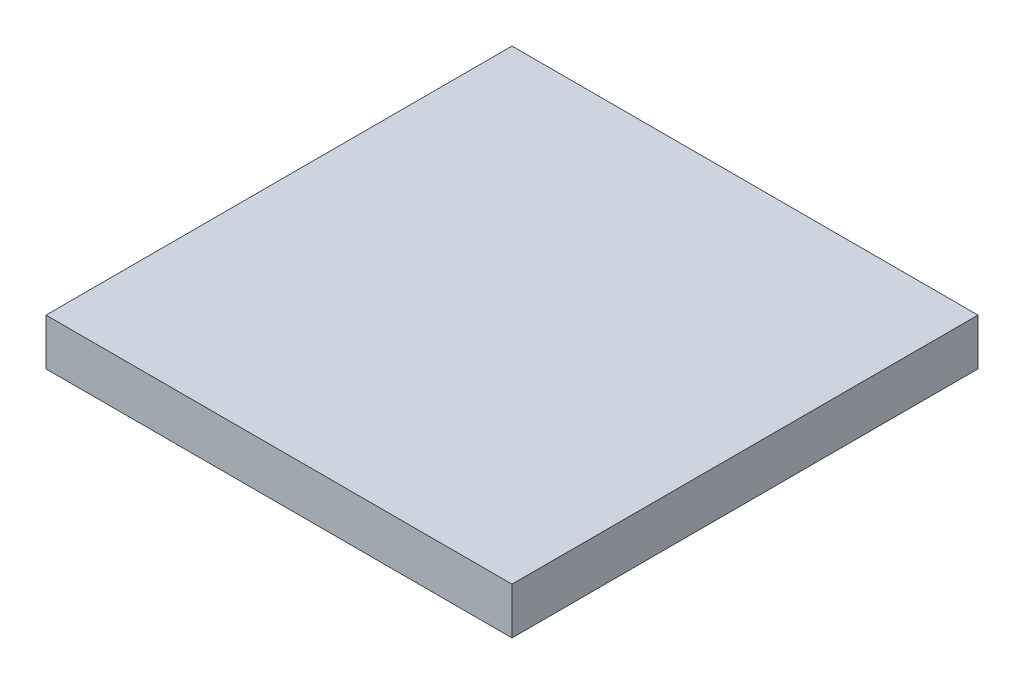
ISO-10303-21;
HEADER;
FILE_DESCRIPTION(('STEP AP214'),'2;1');
FILE_NAME('part.step','',(''),(''),'','','');
FILE_SCHEMA(('AUTOMOTIVE_DESIGN { 1 0 10303 214 1 1 1 1 }'));
ENDSEC;
DATA;
#1=APPLICATION_CONTEXT('core data for automotive mechanical design processes');
#2=APPLICATION_PROTOCOL_DEFINITION('international standard','automotive_design',2000,#1);
#3=PRODUCT_CONTEXT('',#1,'mechanical');
#4=PRODUCT('Part','Part','',(#3));
#5=PRODUCT_RELATED_PRODUCT_CATEGORY('part','',(#4));
#6=PRODUCT_DEFINITION_FORMATION('','',#4);
#7=PRODUCT_DEFINITION_CONTEXT('part definition',#1,'design');
#8=PRODUCT_DEFINITION('design','',#6,#7);
#9=PRODUCT_DEFINITION_SHAPE('','',#8);
#10=(LENGTH_UNIT() NAMED_UNIT(*) SI_UNIT(.MILLI.,.METRE.));
#11=(NAMED_UNIT(*) PLANE_ANGLE_UNIT() SI_UNIT($,.RADIAN.));
#12=(NAMED_UNIT(*) SI_UNIT($,.STERADIAN.) SOLID_ANGLE_UNIT());
#13=UNCERTAINTY_MEASURE_WITH_UNIT(LENGTH_MEASURE(1.E-05),#10,'distance_accuracy_value','');
#14=(GEOMETRIC_REPRESENTATION_CONTEXT(3) GLOBAL_UNCERTAINTY_ASSIGNED_CONTEXT((#13)) GLOBAL_UNIT_ASSIGNED_CONTEXT((#10,
#11,#12)) REPRESENTATION_CONTEXT('',''));
#15=CARTESIAN_POINT('',(0.,0.,0.));
#16=DIRECTION('',(0.,0.,1.));
#17=DIRECTION('',(1.,0.,0.));
#18=AXIS2_PLACEMENT_3D('',#15,#16,#17);
#19=CARTESIAN_POINT('',(0.,0.5,0.));
#20=DIRECTION('',(1.,0.,0.));
#21=DIRECTION('',(0.,0.,-1.));
#22=AXIS2_PLACEMENT_3D('',#19,#20,#21);
#23=PLANE('',#22);
#24=DIRECTION('',(0.,0.,1.));
#25=VECTOR('',#24,1.);
#26=CARTESIAN_POINT('',(0.,0.,0.));
#27=LINE('',#26,#25);
#28=CARTESIAN_POINT('',(0.,0.,-5.));
#29=VERTEX_POINT('',#28);
#30=CARTESIAN_POINT('',(0.,0.,0.));
#31=VERTEX_POINT('',#30);
#32=EDGE_CURVE('E100',#29,#31,#27,.T.);
#33=ORIENTED_EDGE('',*,*,#32,.T.);
#34=DIRECTION('',(0.,-1.,0.));
#35=VECTOR('',#34,1.);
#36=CARTESIAN_POINT('',(0.,0.5,0.));
#37=LINE('',#36,#35);
#38=CARTESIAN_POINT('',(0.,0.5,0.));
#39=VERTEX_POINT('',#38);
#40=EDGE_CURVE('E11',#39,#31,#37,.T.);
#41=ORIENTED_EDGE('',*,*,#40,.F.);
#42=DIRECTION('',(0.,0.,1.));
#43=VECTOR('',#42,1.);
#44=CARTESIAN_POINT('',(0.,0.5,0.));
#45=LINE('',#44,#43);
#46=CARTESIAN_POINT('',(0.,0.5,-5.));
#47=VERTEX_POINT('',#46);
#48=EDGE_CURVE('E88',#47,#39,#45,.T.);
#49=ORIENTED_EDGE('',*,*,#48,.F.);
#50=DIRECTION('',(0.,-1.,0.));
#51=VECTOR('',#50,1.);
#52=CARTESIAN_POINT('',(0.,0.5,-5.));
#53=LINE('',#52,#51);
#54=EDGE_CURVE('E96',#47,#29,#53,.T.);
#55=ORIENTED_EDGE('',*,*,#54,.T.);
#56=EDGE_LOOP('',(#33,#41,#49,#55));
#57=FACE_BOUND('',#56,.T.);
#58=ADVANCED_FACE('F37',(#57),#23,.F.);
#59=CARTESIAN_POINT('',(0.,0.5,0.));
#60=DIRECTION('',(0.,0.,-1.));
#61=DIRECTION('',(-1.,0.,0.));
#62=AXIS2_PLACEMENT_3D('',#59,#60,#61);
#63=PLANE('',#62);
#64=DIRECTION('',(1.,0.,0.));
#65=VECTOR('',#64,1.);
#66=CARTESIAN_POINT('',(0.,0.,0.));
#67=LINE('',#66,#65);
#68=CARTESIAN_POINT('',(5.,0.,0.));
#69=VERTEX_POINT('',#68);
#70=EDGE_CURVE('E92',#31,#69,#67,.T.);
#71=ORIENTED_EDGE('',*,*,#70,.T.);
#72=DIRECTION('',(0.,-1.,0.));
#73=VECTOR('',#72,1.);
#74=CARTESIAN_POINT('',(5.,0.5,0.));
#75=LINE('',#74,#73);
#76=CARTESIAN_POINT('',(5.,0.5,0.));
#77=VERTEX_POINT('',#76);
#78=EDGE_CURVE('E45',#77,#69,#75,.T.);
#79=ORIENTED_EDGE('',*,*,#78,.F.);
#80=DIRECTION('',(1.,0.,0.));
#81=VECTOR('',#80,1.);
#82=CARTESIAN_POINT('',(0.,0.5,0.));
#83=LINE('',#82,#81);
#84=EDGE_CURVE('E83',#39,#77,#83,.T.);
#85=ORIENTED_EDGE('',*,*,#84,.F.);
#86=ORIENTED_EDGE('',*,*,#40,.T.);
#87=EDGE_LOOP('',(#71,#79,#85,#86));
#88=FACE_BOUND('',#87,.T.);
#89=ADVANCED_FACE('F91',(#88),#63,.F.);
#90=CARTESIAN_POINT('',(5.,0.5,0.));
#91=DIRECTION('',(-1.,0.,0.));
#92=DIRECTION('',(0.,0.,1.));
#93=AXIS2_PLACEMENT_3D('',#90,#91,#92);
#94=PLANE('',#93);
#95=DIRECTION('',(0.,0.,-1.));
#96=VECTOR('',#95,1.);
#97=CARTESIAN_POINT('',(5.,0.,0.));
#98=LINE('',#97,#96);
#99=CARTESIAN_POINT('',(5.,0.,-5.));
#100=VERTEX_POINT('',#99);
#101=EDGE_CURVE('E70',#69,#100,#98,.T.);
#102=ORIENTED_EDGE('',*,*,#101,.T.);
#103=DIRECTION('',(0.,-1.,0.));
#104=VECTOR('',#103,1.);
#105=CARTESIAN_POINT('',(5.,0.5,-5.));
#106=LINE('',#105,#104);
#107=CARTESIAN_POINT('',(5.,0.5,-5.));
#108=VERTEX_POINT('',#107);
#109=EDGE_CURVE('E93',#108,#100,#106,.T.);
#110=ORIENTED_EDGE('',*,*,#109,.F.);
#111=DIRECTION('',(0.,0.,-1.));
#112=VECTOR('',#111,1.);
#113=CARTESIAN_POINT('',(5.,0.5,0.));
#114=LINE('',#113,#112);
#115=EDGE_CURVE('E86',#77,#108,#114,.T.);
#116=ORIENTED_EDGE('',*,*,#115,.F.);
#117=ORIENTED_EDGE('',*,*,#78,.T.);
#118=EDGE_LOOP('',(#102,#110,#116,#117));
#119=FACE_BOUND('',#118,.T.);
#120=ADVANCED_FACE('F94',(#119),#94,.F.);
#121=CARTESIAN_POINT('',(0.,0.5,-5.));
#122=DIRECTION('',(0.,0.,1.));
#123=DIRECTION('',(1.,0.,0.));
#124=AXIS2_PLACEMENT_3D('',#121,#122,#123);
#125=PLANE('',#124);
#126=DIRECTION('',(-1.,0.,0.));
#127=VECTOR('',#126,1.);
#128=CARTESIAN_POINT('',(0.,0.,-5.));
#129=LINE('',#128,#127);
#130=EDGE_CURVE('E76',#100,#29,#129,.T.);
#131=ORIENTED_EDGE('',*,*,#130,.T.);
#132=ORIENTED_EDGE('',*,*,#54,.F.);
#133=DIRECTION('',(-1.,0.,0.));
#134=VECTOR('',#133,1.);
#135=CARTESIAN_POINT('',(0.,0.5,-5.));
#136=LINE('',#135,#134);
#137=EDGE_CURVE('E53',#108,#47,#136,.T.);
#138=ORIENTED_EDGE('',*,*,#137,.F.);
#139=ORIENTED_EDGE('',*,*,#109,.T.);
#140=EDGE_LOOP('',(#131,#132,#138,#139));
#141=FACE_BOUND('',#140,.T.);
#142=ADVANCED_FACE('F107',(#141),#125,.F.);
#143=CARTESIAN_POINT('',(0.,0.5,0.));
#144=DIRECTION('',(0.,-1.,0.));
#145=DIRECTION('',(0.,0.,-1.));
#146=AXIS2_PLACEMENT_3D('',#143,#144,#145);
#147=PLANE('',#146);
#148=ORIENTED_EDGE('',*,*,#48,.T.);
#149=ORIENTED_EDGE('',*,*,#84,.T.);
#150=ORIENTED_EDGE('',*,*,#115,.T.);
#151=ORIENTED_EDGE('',*,*,#137,.T.);
#152=EDGE_LOOP('',(#148,#149,#150,#151));
#153=FACE_BOUND('',#152,.T.);
#154=ADVANCED_FACE('F84',(#153),#147,.F.);
#155=CARTESIAN_POINT('',(0.,0.,0.));
#156=DIRECTION('',(0.,-1.,0.));
#157=DIRECTION('',(0.,0.,-1.));
#158=AXIS2_PLACEMENT_3D('',#155,#156,#157);
#159=PLANE('',#158);
#160=ORIENTED_EDGE('',*,*,#32,.F.);
#161=ORIENTED_EDGE('',*,*,#130,.F.);
#162=ORIENTED_EDGE('',*,*,#101,.F.);
#163=ORIENTED_EDGE('',*,*,#70,.F.);
#164=EDGE_LOOP('',(#160,#161,#162,#163));
#165=FACE_BOUND('',#164,.T.);
#166=ADVANCED_FACE('F110',(#165),#159,.T.);
#167=CLOSED_SHELL('',(#58,#89,#120,#142,#154,#166));
#168=MANIFOLD_SOLID_BREP('B2',#167);
#169=ADVANCED_BREP_SHAPE_REPRESENTATION('',(#18,#168),#14);
#170=SHAPE_DEFINITION_REPRESENTATION(#9,#169);
ENDSEC;
END-ISO-10303-21;
